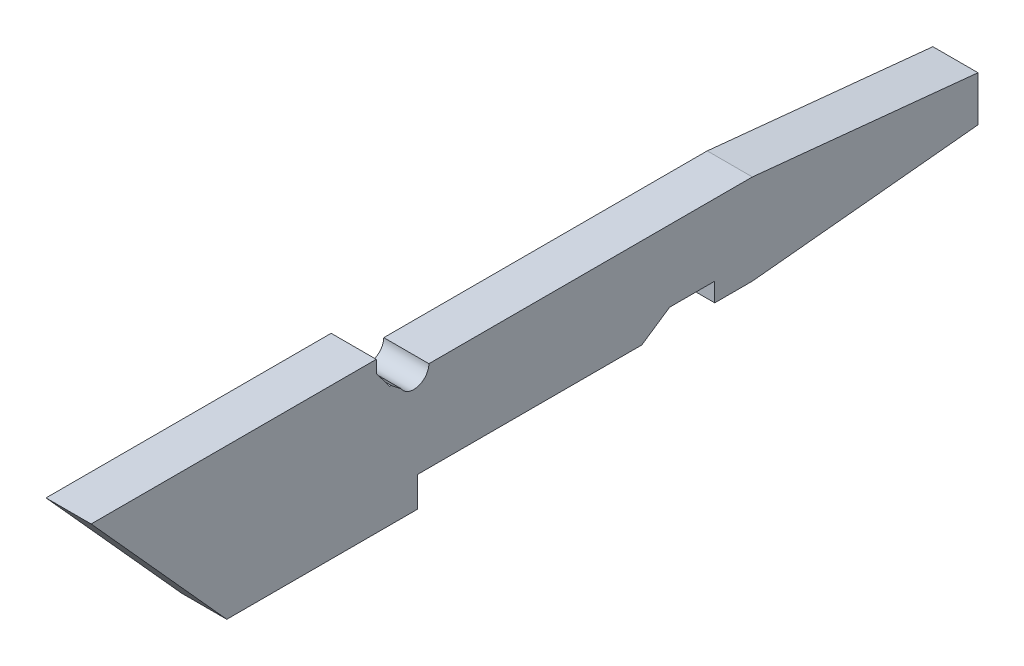
ISO-10303-21;
HEADER;
FILE_DESCRIPTION(('STEP AP214'),'2;1');
FILE_NAME('part.step','',(''),(''),'','','');
FILE_SCHEMA(('AUTOMOTIVE_DESIGN { 1 0 10303 214 1 1 1 1 }'));
ENDSEC;
DATA;
#1=APPLICATION_CONTEXT('core data for automotive mechanical design processes');
#2=APPLICATION_PROTOCOL_DEFINITION('international standard','automotive_design',2000,#1);
#3=PRODUCT_CONTEXT('',#1,'mechanical');
#4=PRODUCT('Part','Part','',(#3));
#5=PRODUCT_RELATED_PRODUCT_CATEGORY('part','',(#4));
#6=PRODUCT_DEFINITION_FORMATION('','',#4);
#7=PRODUCT_DEFINITION_CONTEXT('part definition',#1,'design');
#8=PRODUCT_DEFINITION('design','',#6,#7);
#9=PRODUCT_DEFINITION_SHAPE('','',#8);
#10=(LENGTH_UNIT() NAMED_UNIT(*) SI_UNIT(.MILLI.,.METRE.));
#11=(NAMED_UNIT(*) PLANE_ANGLE_UNIT() SI_UNIT($,.RADIAN.));
#12=(NAMED_UNIT(*) SI_UNIT($,.STERADIAN.) SOLID_ANGLE_UNIT());
#13=UNCERTAINTY_MEASURE_WITH_UNIT(LENGTH_MEASURE(1.E-05),#10,'distance_accuracy_value','');
#14=(GEOMETRIC_REPRESENTATION_CONTEXT(3) GLOBAL_UNCERTAINTY_ASSIGNED_CONTEXT((#13)) GLOBAL_UNIT_ASSIGNED_CONTEXT((#10,
#11,#12)) REPRESENTATION_CONTEXT('',''));
#15=CARTESIAN_POINT('',(0.,0.,0.));
#16=DIRECTION('',(0.,0.,1.));
#17=DIRECTION('',(1.,0.,0.));
#18=AXIS2_PLACEMENT_3D('',#15,#16,#17);
#19=CARTESIAN_POINT('',(6.,6.,0.));
#20=DIRECTION('',(0.,-0.995037190209989,0.0995037190209988));
#21=DIRECTION('',(0.,-0.0995037190209988,-0.995037190209989));
#22=AXIS2_PLACEMENT_3D('',#19,#20,#21);
#23=PLANE('',#22);
#24=DIRECTION('',(0.,0.0995037190209988,0.995037190209989));
#25=VECTOR('',#24,1.);
#26=CARTESIAN_POINT('',(-6.,6.,0.));
#27=LINE('',#26,#25);
#28=CARTESIAN_POINT('',(-6.,6.,0.));
#29=VERTEX_POINT('',#28);
#30=CARTESIAN_POINT('',(-6.,12.,60.));
#31=VERTEX_POINT('',#30);
#32=EDGE_CURVE('E189',#29,#31,#27,.T.);
#33=ORIENTED_EDGE('',*,*,#32,.T.);
#34=DIRECTION('',(-1.,0.,0.));
#35=VECTOR('',#34,1.);
#36=CARTESIAN_POINT('',(6.,12.,60.));
#37=LINE('',#36,#35);
#38=CARTESIAN_POINT('',(6.,12.,60.));
#39=VERTEX_POINT('',#38);
#40=EDGE_CURVE('E11',#39,#31,#37,.T.);
#41=ORIENTED_EDGE('',*,*,#40,.F.);
#42=DIRECTION('',(0.,0.0995037190209988,0.995037190209989));
#43=VECTOR('',#42,1.);
#44=CARTESIAN_POINT('',(6.,6.,0.));
#45=LINE('',#44,#43);
#46=CARTESIAN_POINT('',(6.,6.,0.));
#47=VERTEX_POINT('',#46);
#48=EDGE_CURVE('E223',#47,#39,#45,.T.);
#49=ORIENTED_EDGE('',*,*,#48,.F.);
#50=DIRECTION('',(-1.,0.,0.));
#51=VECTOR('',#50,1.);
#52=CARTESIAN_POINT('',(6.,6.,0.));
#53=LINE('',#52,#51);
#54=EDGE_CURVE('E185',#47,#29,#53,.T.);
#55=ORIENTED_EDGE('',*,*,#54,.T.);
#56=EDGE_LOOP('',(#33,#41,#49,#55));
#57=FACE_BOUND('',#56,.T.);
#58=ADVANCED_FACE('F33',(#57),#23,.F.);
#59=CARTESIAN_POINT('',(6.,12.,60.));
#60=DIRECTION('',(0.,-1.,0.));
#61=DIRECTION('',(0.,0.,-1.));
#62=AXIS2_PLACEMENT_3D('',#59,#60,#61);
#63=PLANE('',#62);
#64=DIRECTION('',(0.,0.,1.));
#65=VECTOR('',#64,1.);
#66=CARTESIAN_POINT('',(-6.,12.,60.));
#67=LINE('',#66,#65);
#68=CARTESIAN_POINT('',(-6.,12.,146.000538152749));
#69=VERTEX_POINT('',#68);
#70=EDGE_CURVE('E192',#31,#69,#67,.T.);
#71=ORIENTED_EDGE('',*,*,#70,.T.);
#72=DIRECTION('',(-1.,0.,0.));
#73=VECTOR('',#72,1.);
#74=CARTESIAN_POINT('',(6.,12.,146.000538152749));
#75=LINE('',#74,#73);
#76=CARTESIAN_POINT('',(6.,12.,146.000538152749));
#77=VERTEX_POINT('',#76);
#78=EDGE_CURVE('E41',#77,#69,#75,.T.);
#79=ORIENTED_EDGE('',*,*,#78,.F.);
#80=DIRECTION('',(0.,0.,1.));
#81=VECTOR('',#80,1.);
#82=CARTESIAN_POINT('',(6.,12.,60.));
#83=LINE('',#82,#81);
#84=EDGE_CURVE('E122',#39,#77,#83,.T.);
#85=ORIENTED_EDGE('',*,*,#84,.F.);
#86=ORIENTED_EDGE('',*,*,#40,.T.);
#87=EDGE_LOOP('',(#71,#79,#85,#86));
#88=FACE_BOUND('',#87,.T.);
#89=ADVANCED_FACE('F331',(#88),#63,.F.);
#90=CARTESIAN_POINT('',(6.,12.0656119835403,150.));
#91=DIRECTION('',(-1.,0.,0.));
#92=DIRECTION('',(0.,0.,1.));
#93=AXIS2_PLACEMENT_3D('',#90,#91,#92);
#94=CYLINDRICAL_SURFACE('',#93,4.);
#95=CARTESIAN_POINT('',(-6.,12.0656119835403,150.));
#96=DIRECTION('',(-1.,0.,0.));
#97=DIRECTION('',(0.,0.,1.));
#98=AXIS2_PLACEMENT_3D('',#95,#96,#97);
#99=CIRCLE('',#98,4.);
#100=CARTESIAN_POINT('',(-6.,9.91948716880485,153.375521926988));
#101=VERTEX_POINT('',#100);
#102=EDGE_CURVE('E194',#69,#101,#99,.T.);
#103=ORIENTED_EDGE('',*,*,#102,.T.);
#104=DIRECTION('',(-1.,0.,0.));
#105=VECTOR('',#104,1.);
#106=CARTESIAN_POINT('',(6.,9.91948716880485,153.375521926988));
#107=LINE('',#106,#105);
#108=CARTESIAN_POINT('',(6.,9.91948716880485,153.375521926988));
#109=VERTEX_POINT('',#108);
#110=EDGE_CURVE('E260',#109,#101,#107,.T.);
#111=ORIENTED_EDGE('',*,*,#110,.F.);
#112=CARTESIAN_POINT('',(6.,12.0656119835403,150.));
#113=DIRECTION('',(-1.,0.,0.));
#114=DIRECTION('',(0.,0.,1.));
#115=AXIS2_PLACEMENT_3D('',#112,#113,#114);
#116=CIRCLE('',#115,4.);
#117=EDGE_CURVE('E268',#77,#109,#116,.T.);
#118=ORIENTED_EDGE('',*,*,#117,.F.);
#119=ORIENTED_EDGE('',*,*,#78,.T.);
#120=EDGE_LOOP('',(#103,#111,#118,#119));
#121=FACE_BOUND('',#120,.T.);
#122=ADVANCED_FACE('F266',(#121),#94,.F.);
#123=CARTESIAN_POINT('',(6.,9.91948716880485,153.375521926988));
#124=DIRECTION('',(0.,-0.785844589239286,0.618424030551318));
#125=DIRECTION('',(0.,-0.618424030551318,-0.785844589239286));
#126=AXIS2_PLACEMENT_3D('',#123,#124,#125);
#127=PLANE('',#126);
#128=DIRECTION('',(0.,0.618424030551318,0.785844589239286));
#129=VECTOR('',#128,1.);
#130=CARTESIAN_POINT('',(-6.,9.91948716880485,153.375521926988));
#131=LINE('',#130,#129);
#132=CARTESIAN_POINT('',(-6.,12.,156.0192739005));
#133=VERTEX_POINT('',#132);
#134=EDGE_CURVE('E196',#101,#133,#131,.T.);
#135=ORIENTED_EDGE('',*,*,#134,.T.);
#136=DIRECTION('',(-1.,0.,0.));
#137=VECTOR('',#136,1.);
#138=CARTESIAN_POINT('',(6.,12.,156.0192739005));
#139=LINE('',#138,#137);
#140=CARTESIAN_POINT('',(6.,12.,156.0192739005));
#141=VERTEX_POINT('',#140);
#142=EDGE_CURVE('E257',#141,#133,#139,.T.);
#143=ORIENTED_EDGE('',*,*,#142,.F.);
#144=DIRECTION('',(0.,0.618424030551318,0.785844589239286));
#145=VECTOR('',#144,1.);
#146=CARTESIAN_POINT('',(6.,9.91948716880485,153.375521926988));
#147=LINE('',#146,#145);
#148=EDGE_CURVE('E286',#109,#141,#147,.T.);
#149=ORIENTED_EDGE('',*,*,#148,.F.);
#150=ORIENTED_EDGE('',*,*,#110,.T.);
#151=EDGE_LOOP('',(#135,#143,#149,#150));
#152=FACE_BOUND('',#151,.T.);
#153=ADVANCED_FACE('F277',(#152),#127,.F.);
#154=CARTESIAN_POINT('',(6.,12.,156.0192739005));
#155=DIRECTION('',(0.,-1.,0.));
#156=DIRECTION('',(0.,0.,-1.));
#157=AXIS2_PLACEMENT_3D('',#154,#155,#156);
#158=PLANE('',#157);
#159=DIRECTION('',(0.,0.,1.));
#160=VECTOR('',#159,1.);
#161=CARTESIAN_POINT('',(-6.,12.,156.0192739005));
#162=LINE('',#161,#160);
#163=CARTESIAN_POINT('',(-6.,12.,156.437513639437));
#164=VERTEX_POINT('',#163);
#165=EDGE_CURVE('E198',#133,#164,#162,.T.);
#166=ORIENTED_EDGE('',*,*,#165,.T.);
#167=DIRECTION('',(-1.,0.,0.));
#168=VECTOR('',#167,1.);
#169=CARTESIAN_POINT('',(6.,12.,156.437513639437));
#170=LINE('',#169,#168);
#171=CARTESIAN_POINT('',(6.,12.,156.437513639437));
#172=VERTEX_POINT('',#171);
#173=EDGE_CURVE('E254',#172,#164,#170,.T.);
#174=ORIENTED_EDGE('',*,*,#173,.F.);
#175=DIRECTION('',(0.,0.,1.));
#176=VECTOR('',#175,1.);
#177=CARTESIAN_POINT('',(6.,12.,156.0192739005));
#178=LINE('',#177,#176);
#179=EDGE_CURVE('E283',#141,#172,#178,.T.);
#180=ORIENTED_EDGE('',*,*,#179,.F.);
#181=ORIENTED_EDGE('',*,*,#142,.T.);
#182=EDGE_LOOP('',(#166,#174,#180,#181));
#183=FACE_BOUND('',#182,.T.);
#184=ADVANCED_FACE('F281',(#183),#158,.F.);
#185=CARTESIAN_POINT('',(6.,12.,156.437513639437));
#186=DIRECTION('',(0.,-0.600000000000003,0.799999999999998));
#187=DIRECTION('',(0.,-0.799999999999998,-0.600000000000003));
#188=AXIS2_PLACEMENT_3D('',#185,#186,#187);
#189=PLANE('',#188);
#190=DIRECTION('',(0.,0.799999999999998,0.600000000000003));
#191=VECTOR('',#190,1.);
#192=CARTESIAN_POINT('',(-6.,12.,156.437513639437));
#193=LINE('',#192,#191);
#194=CARTESIAN_POINT('',(-6.,16.7499818140833,160.));
#195=VERTEX_POINT('',#194);
#196=EDGE_CURVE('E200',#164,#195,#193,.T.);
#197=ORIENTED_EDGE('',*,*,#196,.T.);
#198=DIRECTION('',(-1.,0.,0.));
#199=VECTOR('',#198,1.);
#200=CARTESIAN_POINT('',(6.,16.7499818140833,160.));
#201=LINE('',#200,#199);
#202=CARTESIAN_POINT('',(6.,16.7499818140833,160.));
#203=VERTEX_POINT('',#202);
#204=EDGE_CURVE('E251',#203,#195,#201,.T.);
#205=ORIENTED_EDGE('',*,*,#204,.F.);
#206=DIRECTION('',(0.,0.799999999999998,0.600000000000003));
#207=VECTOR('',#206,1.);
#208=CARTESIAN_POINT('',(6.,12.,156.437513639437));
#209=LINE('',#208,#207);
#210=EDGE_CURVE('E285',#172,#203,#209,.T.);
#211=ORIENTED_EDGE('',*,*,#210,.F.);
#212=ORIENTED_EDGE('',*,*,#173,.T.);
#213=EDGE_LOOP('',(#197,#205,#211,#212));
#214=FACE_BOUND('',#213,.T.);
#215=ADVANCED_FACE('F344',(#214),#189,.F.);
#216=CARTESIAN_POINT('',(6.,16.7499818140833,160.));
#217=DIRECTION('',(0.,0.,1.));
#218=DIRECTION('',(1.,0.,0.));
#219=AXIS2_PLACEMENT_3D('',#216,#217,#218);
#220=PLANE('',#219);
#221=DIRECTION('',(0.,1.,0.));
#222=VECTOR('',#221,1.);
#223=CARTESIAN_POINT('',(-6.,16.7499818140833,160.));
#224=LINE('',#223,#222);
#225=CARTESIAN_POINT('',(-6.,20.,160.));
#226=VERTEX_POINT('',#225);
#227=EDGE_CURVE('E202',#195,#226,#224,.T.);
#228=ORIENTED_EDGE('',*,*,#227,.T.);
#229=DIRECTION('',(-1.,0.,0.));
#230=VECTOR('',#229,1.);
#231=CARTESIAN_POINT('',(6.,20.,160.));
#232=LINE('',#231,#230);
#233=CARTESIAN_POINT('',(6.,20.,160.));
#234=VERTEX_POINT('',#233);
#235=EDGE_CURVE('E248',#234,#226,#232,.T.);
#236=ORIENTED_EDGE('',*,*,#235,.F.);
#237=DIRECTION('',(0.,1.,0.));
#238=VECTOR('',#237,1.);
#239=CARTESIAN_POINT('',(6.,16.7499818140833,160.));
#240=LINE('',#239,#238);
#241=EDGE_CURVE('E288',#203,#234,#240,.T.);
#242=ORIENTED_EDGE('',*,*,#241,.F.);
#243=ORIENTED_EDGE('',*,*,#204,.T.);
#244=EDGE_LOOP('',(#228,#236,#242,#243));
#245=FACE_BOUND('',#244,.T.);
#246=ADVANCED_FACE('F347',(#245),#220,.F.);
#247=CARTESIAN_POINT('',(6.,20.,160.));
#248=DIRECTION('',(0.,-1.,0.));
#249=DIRECTION('',(0.,0.,-1.));
#250=AXIS2_PLACEMENT_3D('',#247,#248,#249);
#251=PLANE('',#250);
#252=DIRECTION('',(0.,0.,1.));
#253=VECTOR('',#252,1.);
#254=CARTESIAN_POINT('',(-6.,20.,160.));
#255=LINE('',#254,#253);
#256=CARTESIAN_POINT('',(-6.,20.,235.816329231345));
#257=VERTEX_POINT('',#256);
#258=EDGE_CURVE('E204',#226,#257,#255,.T.);
#259=ORIENTED_EDGE('',*,*,#258,.T.);
#260=DIRECTION('',(-1.,0.,0.));
#261=VECTOR('',#260,1.);
#262=CARTESIAN_POINT('',(6.,20.,235.816329231345));
#263=LINE('',#262,#261);
#264=CARTESIAN_POINT('',(6.,20.,235.816329231345));
#265=VERTEX_POINT('',#264);
#266=EDGE_CURVE('E245',#265,#257,#263,.T.);
#267=ORIENTED_EDGE('',*,*,#266,.F.);
#268=DIRECTION('',(0.,0.,1.));
#269=VECTOR('',#268,1.);
#270=CARTESIAN_POINT('',(6.,20.,160.));
#271=LINE('',#270,#269);
#272=EDGE_CURVE('E294',#234,#265,#271,.T.);
#273=ORIENTED_EDGE('',*,*,#272,.F.);
#274=ORIENTED_EDGE('',*,*,#235,.T.);
#275=EDGE_LOOP('',(#259,#267,#273,#274));
#276=FACE_BOUND('',#275,.T.);
#277=ADVANCED_FACE('F351',(#276),#251,.F.);
#278=CARTESIAN_POINT('',(6.,20.,235.816329231345));
#279=DIRECTION('',(0.,0.669750758325142,-0.742585969247263));
#280=DIRECTION('',(0.,0.742585969247263,0.669750758325142));
#281=AXIS2_PLACEMENT_3D('',#278,#279,#280);
#282=PLANE('',#281);
#283=DIRECTION('',(0.,-0.742585969247263,-0.669750758325142));
#284=VECTOR('',#283,1.);
#285=CARTESIAN_POINT('',(-6.,20.,235.816329231345));
#286=LINE('',#285,#284);
#287=CARTESIAN_POINT('',(-6.,-20.,199.739657381267));
#288=VERTEX_POINT('',#287);
#289=EDGE_CURVE('E206',#257,#288,#286,.T.);
#290=ORIENTED_EDGE('',*,*,#289,.T.);
#291=DIRECTION('',(-1.,0.,0.));
#292=VECTOR('',#291,1.);
#293=CARTESIAN_POINT('',(6.,-20.,199.739657381267));
#294=LINE('',#293,#292);
#295=CARTESIAN_POINT('',(6.,-20.,199.739657381267));
#296=VERTEX_POINT('',#295);
#297=EDGE_CURVE('E242',#296,#288,#294,.T.);
#298=ORIENTED_EDGE('',*,*,#297,.F.);
#299=DIRECTION('',(0.,-0.742585969247263,-0.669750758325142));
#300=VECTOR('',#299,1.);
#301=CARTESIAN_POINT('',(6.,20.,235.816329231345));
#302=LINE('',#301,#300);
#303=EDGE_CURVE('E296',#265,#296,#302,.T.);
#304=ORIENTED_EDGE('',*,*,#303,.F.);
#305=ORIENTED_EDGE('',*,*,#266,.T.);
#306=EDGE_LOOP('',(#290,#298,#304,#305));
#307=FACE_BOUND('',#306,.T.);
#308=ADVANCED_FACE('F355',(#307),#282,.F.);
#309=CARTESIAN_POINT('',(6.,-20.,199.739657381267));
#310=DIRECTION('',(0.,1.,0.));
#311=DIRECTION('',(0.,0.,1.));
#312=AXIS2_PLACEMENT_3D('',#309,#310,#311);
#313=PLANE('',#312);
#314=DIRECTION('',(0.,0.,-1.));
#315=VECTOR('',#314,1.);
#316=CARTESIAN_POINT('',(-6.,-20.,199.739657381267));
#317=LINE('',#316,#315);
#318=CARTESIAN_POINT('',(-6.,-20.,149.));
#319=VERTEX_POINT('',#318);
#320=EDGE_CURVE('E208',#288,#319,#317,.T.);
#321=ORIENTED_EDGE('',*,*,#320,.T.);
#322=DIRECTION('',(-1.,0.,0.));
#323=VECTOR('',#322,1.);
#324=CARTESIAN_POINT('',(6.,-20.,149.));
#325=LINE('',#324,#323);
#326=CARTESIAN_POINT('',(6.,-20.,149.));
#327=VERTEX_POINT('',#326);
#328=EDGE_CURVE('E239',#327,#319,#325,.T.);
#329=ORIENTED_EDGE('',*,*,#328,.F.);
#330=DIRECTION('',(0.,0.,-1.));
#331=VECTOR('',#330,1.);
#332=CARTESIAN_POINT('',(6.,-20.,199.739657381267));
#333=LINE('',#332,#331);
#334=EDGE_CURVE('E298',#296,#327,#333,.T.);
#335=ORIENTED_EDGE('',*,*,#334,.F.);
#336=ORIENTED_EDGE('',*,*,#297,.T.);
#337=EDGE_LOOP('',(#321,#329,#335,#336));
#338=FACE_BOUND('',#337,.T.);
#339=ADVANCED_FACE('F359',(#338),#313,.F.);
#340=CARTESIAN_POINT('',(6.,-20.,149.));
#341=DIRECTION('',(0.,0.,1.));
#342=DIRECTION('',(1.,0.,0.));
#343=AXIS2_PLACEMENT_3D('',#340,#341,#342);
#344=PLANE('',#343);
#345=DIRECTION('',(0.,1.,0.));
#346=VECTOR('',#345,1.);
#347=CARTESIAN_POINT('',(-6.,-20.,149.));
#348=LINE('',#347,#346);
#349=CARTESIAN_POINT('',(-6.,-12.,149.));
#350=VERTEX_POINT('',#349);
#351=EDGE_CURVE('E210',#319,#350,#348,.T.);
#352=ORIENTED_EDGE('',*,*,#351,.T.);
#353=DIRECTION('',(-1.,0.,0.));
#354=VECTOR('',#353,1.);
#355=CARTESIAN_POINT('',(6.,-12.,149.));
#356=LINE('',#355,#354);
#357=CARTESIAN_POINT('',(6.,-12.,149.));
#358=VERTEX_POINT('',#357);
#359=EDGE_CURVE('E236',#358,#350,#356,.T.);
#360=ORIENTED_EDGE('',*,*,#359,.F.);
#361=DIRECTION('',(0.,1.,0.));
#362=VECTOR('',#361,1.);
#363=CARTESIAN_POINT('',(6.,-20.,149.));
#364=LINE('',#363,#362);
#365=EDGE_CURVE('E300',#327,#358,#364,.T.);
#366=ORIENTED_EDGE('',*,*,#365,.F.);
#367=ORIENTED_EDGE('',*,*,#328,.T.);
#368=EDGE_LOOP('',(#352,#360,#366,#367));
#369=FACE_BOUND('',#368,.T.);
#370=ADVANCED_FACE('F363',(#369),#344,.F.);
#371=CARTESIAN_POINT('',(6.,-12.,89.4030740117454));
#372=DIRECTION('',(0.,1.,0.));
#373=DIRECTION('',(0.,0.,1.));
#374=AXIS2_PLACEMENT_3D('',#371,#372,#373);
#375=PLANE('',#374);
#376=DIRECTION('',(0.,0.,-1.));
#377=VECTOR('',#376,1.);
#378=CARTESIAN_POINT('',(-6.,-12.,89.4030740117454));
#379=LINE('',#378,#377);
#380=CARTESIAN_POINT('',(-6.,-12.,89.4030740117454));
#381=VERTEX_POINT('',#380);
#382=EDGE_CURVE('E212',#350,#381,#379,.T.);
#383=ORIENTED_EDGE('',*,*,#382,.T.);
#384=DIRECTION('',(-1.,0.,0.));
#385=VECTOR('',#384,1.);
#386=CARTESIAN_POINT('',(6.,-12.,89.4030740117454));
#387=LINE('',#386,#385);
#388=CARTESIAN_POINT('',(6.,-12.,89.4030740117454));
#389=VERTEX_POINT('',#388);
#390=EDGE_CURVE('E233',#389,#381,#387,.T.);
#391=ORIENTED_EDGE('',*,*,#390,.F.);
#392=DIRECTION('',(0.,0.,-1.));
#393=VECTOR('',#392,1.);
#394=CARTESIAN_POINT('',(6.,-12.,89.4030740117454));
#395=LINE('',#394,#393);
#396=EDGE_CURVE('E302',#358,#389,#395,.T.);
#397=ORIENTED_EDGE('',*,*,#396,.F.);
#398=ORIENTED_EDGE('',*,*,#359,.T.);
#399=EDGE_LOOP('',(#383,#391,#397,#398));
#400=FACE_BOUND('',#399,.T.);
#401=ADVANCED_FACE('F367',(#400),#375,.F.);
#402=CARTESIAN_POINT('',(6.,-7.00000000000001,82.));
#403=DIRECTION('',(0.,0.828696809228924,0.5596977741369));
#404=DIRECTION('',(0.,-0.5596977741369,0.828696809228924));
#405=AXIS2_PLACEMENT_3D('',#402,#403,#404);
#406=PLANE('',#405);
#407=DIRECTION('',(0.,0.5596977741369,-0.828696809228924));
#408=VECTOR('',#407,1.);
#409=CARTESIAN_POINT('',(-6.,-7.00000000000001,82.));
#410=LINE('',#409,#408);
#411=CARTESIAN_POINT('',(-6.,-7.00000000000001,82.));
#412=VERTEX_POINT('',#411);
#413=EDGE_CURVE('E214',#381,#412,#410,.T.);
#414=ORIENTED_EDGE('',*,*,#413,.T.);
#415=DIRECTION('',(-1.,0.,0.));
#416=VECTOR('',#415,1.);
#417=CARTESIAN_POINT('',(6.,-7.00000000000001,82.));
#418=LINE('',#417,#416);
#419=CARTESIAN_POINT('',(6.,-7.00000000000001,82.));
#420=VERTEX_POINT('',#419);
#421=EDGE_CURVE('E230',#420,#412,#418,.T.);
#422=ORIENTED_EDGE('',*,*,#421,.F.);
#423=DIRECTION('',(0.,0.5596977741369,-0.828696809228924));
#424=VECTOR('',#423,1.);
#425=CARTESIAN_POINT('',(6.,-7.00000000000001,82.));
#426=LINE('',#425,#424);
#427=EDGE_CURVE('E304',#389,#420,#426,.T.);
#428=ORIENTED_EDGE('',*,*,#427,.F.);
#429=ORIENTED_EDGE('',*,*,#390,.T.);
#430=EDGE_LOOP('',(#414,#422,#428,#429));
#431=FACE_BOUND('',#430,.T.);
#432=ADVANCED_FACE('F371',(#431),#406,.F.);
#433=CARTESIAN_POINT('',(6.,-7.00000000000001,70.));
#434=DIRECTION('',(0.,1.,0.));
#435=DIRECTION('',(0.,0.,1.));
#436=AXIS2_PLACEMENT_3D('',#433,#434,#435);
#437=PLANE('',#436);
#438=DIRECTION('',(0.,0.,-1.));
#439=VECTOR('',#438,1.);
#440=CARTESIAN_POINT('',(-6.,-7.00000000000001,70.));
#441=LINE('',#440,#439);
#442=CARTESIAN_POINT('',(-6.,-7.00000000000001,70.));
#443=VERTEX_POINT('',#442);
#444=EDGE_CURVE('E216',#412,#443,#441,.T.);
#445=ORIENTED_EDGE('',*,*,#444,.T.);
#446=DIRECTION('',(-1.,0.,0.));
#447=VECTOR('',#446,1.);
#448=CARTESIAN_POINT('',(6.,-7.00000000000001,70.));
#449=LINE('',#448,#447);
#450=CARTESIAN_POINT('',(6.,-7.00000000000001,70.));
#451=VERTEX_POINT('',#450);
#452=EDGE_CURVE('E227',#451,#443,#449,.T.);
#453=ORIENTED_EDGE('',*,*,#452,.F.);
#454=DIRECTION('',(0.,0.,-1.));
#455=VECTOR('',#454,1.);
#456=CARTESIAN_POINT('',(6.,-7.00000000000001,70.));
#457=LINE('',#456,#455);
#458=EDGE_CURVE('E306',#420,#451,#457,.T.);
#459=ORIENTED_EDGE('',*,*,#458,.F.);
#460=ORIENTED_EDGE('',*,*,#421,.T.);
#461=EDGE_LOOP('',(#445,#453,#459,#460));
#462=FACE_BOUND('',#461,.T.);
#463=ADVANCED_FACE('F312',(#462),#437,.F.);
#464=CARTESIAN_POINT('',(6.,-12.,70.));
#465=DIRECTION('',(0.,0.,-1.));
#466=DIRECTION('',(-1.,0.,0.));
#467=AXIS2_PLACEMENT_3D('',#464,#465,#466);
#468=PLANE('',#467);
#469=DIRECTION('',(0.,-1.,0.));
#470=VECTOR('',#469,1.);
#471=CARTESIAN_POINT('',(-6.,-12.,70.));
#472=LINE('',#471,#470);
#473=CARTESIAN_POINT('',(-6.,-12.,70.));
#474=VERTEX_POINT('',#473);
#475=EDGE_CURVE('E218',#443,#474,#472,.T.);
#476=ORIENTED_EDGE('',*,*,#475,.T.);
#477=DIRECTION('',(-1.,0.,0.));
#478=VECTOR('',#477,1.);
#479=CARTESIAN_POINT('',(6.,-12.,70.));
#480=LINE('',#479,#478);
#481=CARTESIAN_POINT('',(6.,-12.,70.));
#482=VERTEX_POINT('',#481);
#483=EDGE_CURVE('E180',#482,#474,#480,.T.);
#484=ORIENTED_EDGE('',*,*,#483,.F.);
#485=DIRECTION('',(0.,-1.,0.));
#486=VECTOR('',#485,1.);
#487=CARTESIAN_POINT('',(6.,-12.,70.));
#488=LINE('',#487,#486);
#489=EDGE_CURVE('E171',#451,#482,#488,.T.);
#490=ORIENTED_EDGE('',*,*,#489,.F.);
#491=ORIENTED_EDGE('',*,*,#452,.T.);
#492=EDGE_LOOP('',(#476,#484,#490,#491));
#493=FACE_BOUND('',#492,.T.);
#494=ADVANCED_FACE('F316',(#493),#468,.F.);
#495=CARTESIAN_POINT('',(6.,-12.,60.));
#496=DIRECTION('',(0.,1.,0.));
#497=DIRECTION('',(0.,0.,1.));
#498=AXIS2_PLACEMENT_3D('',#495,#496,#497);
#499=PLANE('',#498);
#500=DIRECTION('',(0.,0.,-1.));
#501=VECTOR('',#500,1.);
#502=CARTESIAN_POINT('',(-6.,-12.,60.));
#503=LINE('',#502,#501);
#504=CARTESIAN_POINT('',(-6.,-12.,60.));
#505=VERTEX_POINT('',#504);
#506=EDGE_CURVE('E179',#474,#505,#503,.T.);
#507=ORIENTED_EDGE('',*,*,#506,.T.);
#508=DIRECTION('',(-1.,0.,0.));
#509=VECTOR('',#508,1.);
#510=CARTESIAN_POINT('',(6.,-12.,60.));
#511=LINE('',#510,#509);
#512=CARTESIAN_POINT('',(6.,-12.,60.));
#513=VERTEX_POINT('',#512);
#514=EDGE_CURVE('E176',#513,#505,#511,.T.);
#515=ORIENTED_EDGE('',*,*,#514,.F.);
#516=DIRECTION('',(0.,0.,-1.));
#517=VECTOR('',#516,1.);
#518=CARTESIAN_POINT('',(6.,-12.,60.));
#519=LINE('',#518,#517);
#520=EDGE_CURVE('E165',#482,#513,#519,.T.);
#521=ORIENTED_EDGE('',*,*,#520,.F.);
#522=ORIENTED_EDGE('',*,*,#483,.T.);
#523=EDGE_LOOP('',(#507,#515,#521,#522));
#524=FACE_BOUND('',#523,.T.);
#525=ADVANCED_FACE('F177',(#524),#499,.F.);
#526=CARTESIAN_POINT('',(6.,-6.,0.));
#527=DIRECTION('',(0.,0.995037190209989,0.099503719020999));
#528=DIRECTION('',(0.,-0.099503719020999,0.995037190209989));
#529=AXIS2_PLACEMENT_3D('',#526,#527,#528);
#530=PLANE('',#529);
#531=DIRECTION('',(0.,0.099503719020999,-0.995037190209989));
#532=VECTOR('',#531,1.);
#533=CARTESIAN_POINT('',(-6.,-6.,0.));
#534=LINE('',#533,#532);
#535=CARTESIAN_POINT('',(-6.,-6.,0.));
#536=VERTEX_POINT('',#535);
#537=EDGE_CURVE('E108',#505,#536,#534,.T.);
#538=ORIENTED_EDGE('',*,*,#537,.T.);
#539=DIRECTION('',(-1.,0.,0.));
#540=VECTOR('',#539,1.);
#541=CARTESIAN_POINT('',(6.,-6.,0.));
#542=LINE('',#541,#540);
#543=CARTESIAN_POINT('',(6.,-6.,0.));
#544=VERTEX_POINT('',#543);
#545=EDGE_CURVE('E181',#544,#536,#542,.T.);
#546=ORIENTED_EDGE('',*,*,#545,.F.);
#547=DIRECTION('',(0.,0.099503719020999,-0.995037190209989));
#548=VECTOR('',#547,1.);
#549=CARTESIAN_POINT('',(6.,-6.,0.));
#550=LINE('',#549,#548);
#551=EDGE_CURVE('E169',#513,#544,#550,.T.);
#552=ORIENTED_EDGE('',*,*,#551,.F.);
#553=ORIENTED_EDGE('',*,*,#514,.T.);
#554=EDGE_LOOP('',(#538,#546,#552,#553));
#555=FACE_BOUND('',#554,.T.);
#556=ADVANCED_FACE('F183',(#555),#530,.F.);
#557=CARTESIAN_POINT('',(6.,6.,0.));
#558=DIRECTION('',(0.,0.,1.));
#559=DIRECTION('',(1.,0.,0.));
#560=AXIS2_PLACEMENT_3D('',#557,#558,#559);
#561=PLANE('',#560);
#562=DIRECTION('',(0.,1.,0.));
#563=VECTOR('',#562,1.);
#564=CARTESIAN_POINT('',(-6.,6.,0.));
#565=LINE('',#564,#563);
#566=EDGE_CURVE('E114',#536,#29,#565,.T.);
#567=ORIENTED_EDGE('',*,*,#566,.T.);
#568=ORIENTED_EDGE('',*,*,#54,.F.);
#569=DIRECTION('',(0.,1.,0.));
#570=VECTOR('',#569,1.);
#571=CARTESIAN_POINT('',(6.,6.,0.));
#572=LINE('',#571,#570);
#573=EDGE_CURVE('E49',#544,#47,#572,.T.);
#574=ORIENTED_EDGE('',*,*,#573,.F.);
#575=ORIENTED_EDGE('',*,*,#545,.T.);
#576=EDGE_LOOP('',(#567,#568,#574,#575));
#577=FACE_BOUND('',#576,.T.);
#578=ADVANCED_FACE('F320',(#577),#561,.F.);
#579=CARTESIAN_POINT('',(6.,12.0656119835403,150.));
#580=DIRECTION('',(-1.,0.,0.));
#581=DIRECTION('',(0.,0.,1.));
#582=AXIS2_PLACEMENT_3D('',#579,#580,#581);
#583=PLANE('',#582);
#584=ORIENTED_EDGE('',*,*,#48,.T.);
#585=ORIENTED_EDGE('',*,*,#84,.T.);
#586=ORIENTED_EDGE('',*,*,#117,.T.);
#587=ORIENTED_EDGE('',*,*,#148,.T.);
#588=ORIENTED_EDGE('',*,*,#179,.T.);
#589=ORIENTED_EDGE('',*,*,#210,.T.);
#590=ORIENTED_EDGE('',*,*,#241,.T.);
#591=ORIENTED_EDGE('',*,*,#272,.T.);
#592=ORIENTED_EDGE('',*,*,#303,.T.);
#593=ORIENTED_EDGE('',*,*,#334,.T.);
#594=ORIENTED_EDGE('',*,*,#365,.T.);
#595=ORIENTED_EDGE('',*,*,#396,.T.);
#596=ORIENTED_EDGE('',*,*,#427,.T.);
#597=ORIENTED_EDGE('',*,*,#458,.T.);
#598=ORIENTED_EDGE('',*,*,#489,.T.);
#599=ORIENTED_EDGE('',*,*,#520,.T.);
#600=ORIENTED_EDGE('',*,*,#551,.T.);
#601=ORIENTED_EDGE('',*,*,#573,.T.);
#602=EDGE_LOOP('',(#584,#585,#586,#587,#588,#589,#590,#591,#592,#593,#594,#595,#596,#597,#598,
#599,#600,#601));
#603=FACE_BOUND('',#602,.T.);
#604=ADVANCED_FACE('F167',(#603),#583,.F.);
#605=CARTESIAN_POINT('',(-6.,12.0656119835403,150.));
#606=DIRECTION('',(-1.,0.,0.));
#607=DIRECTION('',(0.,0.,1.));
#608=AXIS2_PLACEMENT_3D('',#605,#606,#607);
#609=PLANE('',#608);
#610=ORIENTED_EDGE('',*,*,#32,.F.);
#611=ORIENTED_EDGE('',*,*,#566,.F.);
#612=ORIENTED_EDGE('',*,*,#537,.F.);
#613=ORIENTED_EDGE('',*,*,#506,.F.);
#614=ORIENTED_EDGE('',*,*,#475,.F.);
#615=ORIENTED_EDGE('',*,*,#444,.F.);
#616=ORIENTED_EDGE('',*,*,#413,.F.);
#617=ORIENTED_EDGE('',*,*,#382,.F.);
#618=ORIENTED_EDGE('',*,*,#351,.F.);
#619=ORIENTED_EDGE('',*,*,#320,.F.);
#620=ORIENTED_EDGE('',*,*,#289,.F.);
#621=ORIENTED_EDGE('',*,*,#258,.F.);
#622=ORIENTED_EDGE('',*,*,#227,.F.);
#623=ORIENTED_EDGE('',*,*,#196,.F.);
#624=ORIENTED_EDGE('',*,*,#165,.F.);
#625=ORIENTED_EDGE('',*,*,#134,.F.);
#626=ORIENTED_EDGE('',*,*,#102,.F.);
#627=ORIENTED_EDGE('',*,*,#70,.F.);
#628=EDGE_LOOP('',(#610,#611,#612,#613,#614,#615,#616,#617,#618,#619,#620,#621,#622,#623,#624,
#625,#626,#627));
#629=FACE_BOUND('',#628,.T.);
#630=ADVANCED_FACE('F272',(#629),#609,.T.);
#631=CLOSED_SHELL('',(#58,#89,#122,#153,#184,#215,#246,#277,#308,#339,#370,#401,#432,#463,#494,
#525,#556,#578,#604,#630));
#632=MANIFOLD_SOLID_BREP('B2',#631);
#633=ADVANCED_BREP_SHAPE_REPRESENTATION('',(#18,#632),#14);
#634=SHAPE_DEFINITION_REPRESENTATION(#9,#633);
ENDSEC;
END-ISO-10303-21;
